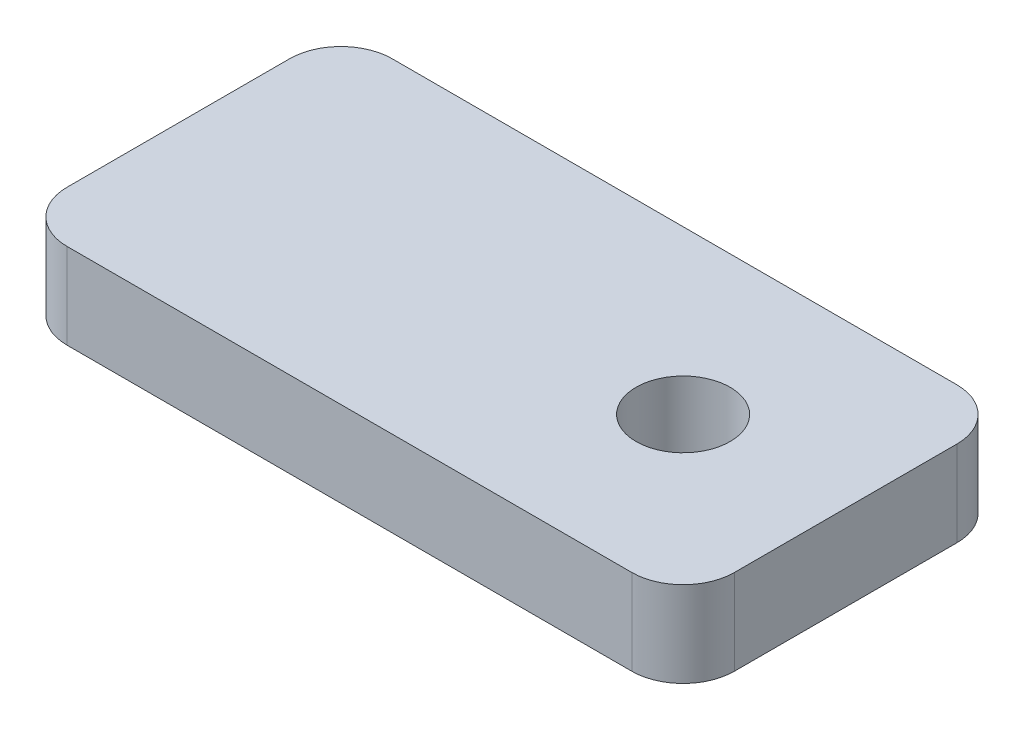
ISO-10303-21;
HEADER;
FILE_DESCRIPTION(('STEP AP214'),'2;1');
FILE_NAME('part.step','',(''),(''),'','','');
FILE_SCHEMA(('AUTOMOTIVE_DESIGN { 1 0 10303 214 1 1 1 1 }'));
ENDSEC;
DATA;
#1=APPLICATION_CONTEXT('core data for automotive mechanical design processes');
#2=APPLICATION_PROTOCOL_DEFINITION('international standard','automotive_design',2000,#1);
#3=PRODUCT_CONTEXT('',#1,'mechanical');
#4=PRODUCT('Part','Part','',(#3));
#5=PRODUCT_RELATED_PRODUCT_CATEGORY('part','',(#4));
#6=PRODUCT_DEFINITION_FORMATION('','',#4);
#7=PRODUCT_DEFINITION_CONTEXT('part definition',#1,'design');
#8=PRODUCT_DEFINITION('design','',#6,#7);
#9=PRODUCT_DEFINITION_SHAPE('','',#8);
#10=(LENGTH_UNIT() NAMED_UNIT(*) SI_UNIT(.MILLI.,.METRE.));
#11=(NAMED_UNIT(*) PLANE_ANGLE_UNIT() SI_UNIT($,.RADIAN.));
#12=(NAMED_UNIT(*) SI_UNIT($,.STERADIAN.) SOLID_ANGLE_UNIT());
#13=UNCERTAINTY_MEASURE_WITH_UNIT(LENGTH_MEASURE(1.E-05),#10,'distance_accuracy_value','');
#14=(GEOMETRIC_REPRESENTATION_CONTEXT(3) GLOBAL_UNCERTAINTY_ASSIGNED_CONTEXT((#13)) GLOBAL_UNIT_ASSIGNED_CONTEXT((#10,
#11,#12)) REPRESENTATION_CONTEXT('',''));
#15=CARTESIAN_POINT('',(0.,0.,0.));
#16=DIRECTION('',(0.,0.,1.));
#17=DIRECTION('',(1.,0.,0.));
#18=AXIS2_PLACEMENT_3D('',#15,#16,#17);
#19=CARTESIAN_POINT('',(-16.5,-5.,6.5));
#20=DIRECTION('',(0.,1.,0.));
#21=DIRECTION('',(0.,0.,1.));
#22=AXIS2_PLACEMENT_3D('',#19,#20,#21);
#23=CYLINDRICAL_SURFACE('',#22,3.);
#24=CARTESIAN_POINT('',(-16.5,0.,6.5));
#25=DIRECTION('',(0.,1.,0.));
#26=DIRECTION('',(0.,0.,-1.));
#27=AXIS2_PLACEMENT_3D('',#24,#25,#26);
#28=CIRCLE('',#27,3.);
#29=CARTESIAN_POINT('',(-19.5,0.,6.5));
#30=VERTEX_POINT('',#29);
#31=CARTESIAN_POINT('',(-16.5,0.,9.49999999999999));
#32=VERTEX_POINT('',#31);
#33=EDGE_CURVE('E158',#30,#32,#28,.T.);
#34=ORIENTED_EDGE('',*,*,#33,.F.);
#35=DIRECTION('',(0.,1.,0.));
#36=VECTOR('',#35,1.);
#37=CARTESIAN_POINT('',(-19.5,-5.,6.5));
#38=LINE('',#37,#36);
#39=CARTESIAN_POINT('',(-19.5,-5.,6.5));
#40=VERTEX_POINT('',#39);
#41=EDGE_CURVE('E11',#40,#30,#38,.T.);
#42=ORIENTED_EDGE('',*,*,#41,.F.);
#43=CARTESIAN_POINT('',(-16.5,-5.,6.5));
#44=DIRECTION('',(0.,1.,0.));
#45=DIRECTION('',(0.,0.,-1.));
#46=AXIS2_PLACEMENT_3D('',#43,#44,#45);
#47=CIRCLE('',#46,3.);
#48=CARTESIAN_POINT('',(-16.5,-5.,9.49999999999999));
#49=VERTEX_POINT('',#48);
#50=EDGE_CURVE('E186',#40,#49,#47,.T.);
#51=ORIENTED_EDGE('',*,*,#50,.T.);
#52=DIRECTION('',(0.,1.,0.));
#53=VECTOR('',#52,1.);
#54=CARTESIAN_POINT('',(-16.5,-5.,9.49999999999999));
#55=LINE('',#54,#53);
#56=EDGE_CURVE('E45',#49,#32,#55,.T.);
#57=ORIENTED_EDGE('',*,*,#56,.T.);
#58=EDGE_LOOP('',(#34,#42,#51,#57));
#59=FACE_BOUND('',#58,.T.);
#60=ADVANCED_FACE('F42',(#59),#23,.T.);
#61=CARTESIAN_POINT('',(-19.5,-5.,6.5));
#62=DIRECTION('',(-1.,0.,0.));
#63=DIRECTION('',(0.,0.,1.));
#64=AXIS2_PLACEMENT_3D('',#61,#62,#63);
#65=PLANE('',#64);
#66=DIRECTION('',(0.,0.,1.));
#67=VECTOR('',#66,1.);
#68=CARTESIAN_POINT('',(-19.5,0.,6.5));
#69=LINE('',#68,#67);
#70=CARTESIAN_POINT('',(-19.5,0.,-6.49999999999999));
#71=VERTEX_POINT('',#70);
#72=EDGE_CURVE('E183',#71,#30,#69,.T.);
#73=ORIENTED_EDGE('',*,*,#72,.F.);
#74=DIRECTION('',(0.,1.,0.));
#75=VECTOR('',#74,1.);
#76=CARTESIAN_POINT('',(-19.5,-5.,-6.49999999999999));
#77=LINE('',#76,#75);
#78=CARTESIAN_POINT('',(-19.5,-5.,-6.49999999999999));
#79=VERTEX_POINT('',#78);
#80=EDGE_CURVE('E52',#79,#71,#77,.T.);
#81=ORIENTED_EDGE('',*,*,#80,.F.);
#82=DIRECTION('',(0.,0.,1.));
#83=VECTOR('',#82,1.);
#84=CARTESIAN_POINT('',(-19.5,-5.,6.5));
#85=LINE('',#84,#83);
#86=EDGE_CURVE('E143',#79,#40,#85,.T.);
#87=ORIENTED_EDGE('',*,*,#86,.T.);
#88=ORIENTED_EDGE('',*,*,#41,.T.);
#89=EDGE_LOOP('',(#73,#81,#87,#88));
#90=FACE_BOUND('',#89,.T.);
#91=ADVANCED_FACE('F202',(#90),#65,.T.);
#92=CARTESIAN_POINT('',(-16.5,-5.,-6.49999999999999));
#93=DIRECTION('',(0.,1.,0.));
#94=DIRECTION('',(0.,0.,1.));
#95=AXIS2_PLACEMENT_3D('',#92,#93,#94);
#96=CYLINDRICAL_SURFACE('',#95,3.);
#97=CARTESIAN_POINT('',(-16.5,0.,-6.49999999999999));
#98=DIRECTION('',(0.,1.,0.));
#99=DIRECTION('',(0.,0.,1.));
#100=AXIS2_PLACEMENT_3D('',#97,#98,#99);
#101=CIRCLE('',#100,3.);
#102=CARTESIAN_POINT('',(-16.5,0.,-9.49999999999999));
#103=VERTEX_POINT('',#102);
#104=EDGE_CURVE('E129',#103,#71,#101,.T.);
#105=ORIENTED_EDGE('',*,*,#104,.F.);
#106=DIRECTION('',(0.,1.,0.));
#107=VECTOR('',#106,1.);
#108=CARTESIAN_POINT('',(-16.5,-5.,-9.49999999999999));
#109=LINE('',#108,#107);
#110=CARTESIAN_POINT('',(-16.5,-5.,-9.49999999999999));
#111=VERTEX_POINT('',#110);
#112=EDGE_CURVE('E124',#111,#103,#109,.T.);
#113=ORIENTED_EDGE('',*,*,#112,.F.);
#114=CARTESIAN_POINT('',(-16.5,-5.,-6.49999999999999));
#115=DIRECTION('',(0.,1.,0.));
#116=DIRECTION('',(0.,0.,1.));
#117=AXIS2_PLACEMENT_3D('',#114,#115,#116);
#118=CIRCLE('',#117,3.);
#119=EDGE_CURVE('E127',#111,#79,#118,.T.);
#120=ORIENTED_EDGE('',*,*,#119,.T.);
#121=ORIENTED_EDGE('',*,*,#80,.T.);
#122=EDGE_LOOP('',(#105,#113,#120,#121));
#123=FACE_BOUND('',#122,.T.);
#124=ADVANCED_FACE('F126',(#123),#96,.T.);
#125=CARTESIAN_POINT('',(-16.5,-5.,-9.49999999999999));
#126=DIRECTION('',(0.,0.,-1.));
#127=DIRECTION('',(-1.,0.,0.));
#128=AXIS2_PLACEMENT_3D('',#125,#126,#127);
#129=PLANE('',#128);
#130=DIRECTION('',(-1.,0.,0.));
#131=VECTOR('',#130,1.);
#132=CARTESIAN_POINT('',(-16.5,0.,-9.49999999999999));
#133=LINE('',#132,#131);
#134=CARTESIAN_POINT('',(16.5,0.,-9.49999999999999));
#135=VERTEX_POINT('',#134);
#136=EDGE_CURVE('E178',#135,#103,#133,.T.);
#137=ORIENTED_EDGE('',*,*,#136,.F.);
#138=DIRECTION('',(0.,1.,0.));
#139=VECTOR('',#138,1.);
#140=CARTESIAN_POINT('',(16.5,-5.,-9.49999999999999));
#141=LINE('',#140,#139);
#142=CARTESIAN_POINT('',(16.5,-5.,-9.49999999999999));
#143=VERTEX_POINT('',#142);
#144=EDGE_CURVE('E135',#143,#135,#141,.T.);
#145=ORIENTED_EDGE('',*,*,#144,.F.);
#146=DIRECTION('',(-1.,0.,0.));
#147=VECTOR('',#146,1.);
#148=CARTESIAN_POINT('',(-16.5,-5.,-9.49999999999999));
#149=LINE('',#148,#147);
#150=EDGE_CURVE('E141',#143,#111,#149,.T.);
#151=ORIENTED_EDGE('',*,*,#150,.T.);
#152=ORIENTED_EDGE('',*,*,#112,.T.);
#153=EDGE_LOOP('',(#137,#145,#151,#152));
#154=FACE_BOUND('',#153,.T.);
#155=ADVANCED_FACE('F146',(#154),#129,.T.);
#156=CARTESIAN_POINT('',(16.5,-5.,-6.49999999999999));
#157=DIRECTION('',(0.,1.,0.));
#158=DIRECTION('',(0.,0.,1.));
#159=AXIS2_PLACEMENT_3D('',#156,#157,#158);
#160=CYLINDRICAL_SURFACE('',#159,3.);
#161=CARTESIAN_POINT('',(16.5,0.,-6.49999999999999));
#162=DIRECTION('',(0.,1.,0.));
#163=DIRECTION('',(0.,0.,1.));
#164=AXIS2_PLACEMENT_3D('',#161,#162,#163);
#165=CIRCLE('',#164,3.);
#166=CARTESIAN_POINT('',(19.5,0.,-6.49999999999999));
#167=VERTEX_POINT('',#166);
#168=EDGE_CURVE('E174',#167,#135,#165,.T.);
#169=ORIENTED_EDGE('',*,*,#168,.F.);
#170=DIRECTION('',(0.,1.,0.));
#171=VECTOR('',#170,1.);
#172=CARTESIAN_POINT('',(19.5,-5.,-6.49999999999999));
#173=LINE('',#172,#171);
#174=CARTESIAN_POINT('',(19.5,-5.,-6.49999999999999));
#175=VERTEX_POINT('',#174);
#176=EDGE_CURVE('E192',#175,#167,#173,.T.);
#177=ORIENTED_EDGE('',*,*,#176,.F.);
#178=CARTESIAN_POINT('',(16.5,-5.,-6.49999999999999));
#179=DIRECTION('',(0.,1.,0.));
#180=DIRECTION('',(0.,0.,1.));
#181=AXIS2_PLACEMENT_3D('',#178,#179,#180);
#182=CIRCLE('',#181,3.);
#183=EDGE_CURVE('E148',#175,#143,#182,.T.);
#184=ORIENTED_EDGE('',*,*,#183,.T.);
#185=ORIENTED_EDGE('',*,*,#144,.T.);
#186=EDGE_LOOP('',(#169,#177,#184,#185));
#187=FACE_BOUND('',#186,.T.);
#188=ADVANCED_FACE('F215',(#187),#160,.T.);
#189=CARTESIAN_POINT('',(19.5,-5.,6.5));
#190=DIRECTION('',(1.,0.,0.));
#191=DIRECTION('',(0.,0.,-1.));
#192=AXIS2_PLACEMENT_3D('',#189,#190,#191);
#193=PLANE('',#192);
#194=DIRECTION('',(0.,0.,-1.));
#195=VECTOR('',#194,1.);
#196=CARTESIAN_POINT('',(19.5,0.,6.5));
#197=LINE('',#196,#195);
#198=CARTESIAN_POINT('',(19.5,0.,6.5));
#199=VERTEX_POINT('',#198);
#200=EDGE_CURVE('E170',#199,#167,#197,.T.);
#201=ORIENTED_EDGE('',*,*,#200,.F.);
#202=DIRECTION('',(0.,1.,0.));
#203=VECTOR('',#202,1.);
#204=CARTESIAN_POINT('',(19.5,-5.,6.5));
#205=LINE('',#204,#203);
#206=CARTESIAN_POINT('',(19.5,-5.,6.5));
#207=VERTEX_POINT('',#206);
#208=EDGE_CURVE('E195',#207,#199,#205,.T.);
#209=ORIENTED_EDGE('',*,*,#208,.F.);
#210=DIRECTION('',(0.,0.,-1.));
#211=VECTOR('',#210,1.);
#212=CARTESIAN_POINT('',(19.5,-5.,6.5));
#213=LINE('',#212,#211);
#214=EDGE_CURVE('E152',#207,#175,#213,.T.);
#215=ORIENTED_EDGE('',*,*,#214,.T.);
#216=ORIENTED_EDGE('',*,*,#176,.T.);
#217=EDGE_LOOP('',(#201,#209,#215,#216));
#218=FACE_BOUND('',#217,.T.);
#219=ADVANCED_FACE('F218',(#218),#193,.T.);
#220=CARTESIAN_POINT('',(16.5,-5.,6.5));
#221=DIRECTION('',(0.,1.,0.));
#222=DIRECTION('',(0.,0.,1.));
#223=AXIS2_PLACEMENT_3D('',#220,#221,#222);
#224=CYLINDRICAL_SURFACE('',#223,3.);
#225=CARTESIAN_POINT('',(16.5,0.,6.5));
#226=DIRECTION('',(0.,1.,0.));
#227=DIRECTION('',(0.,0.,1.));
#228=AXIS2_PLACEMENT_3D('',#225,#226,#227);
#229=CIRCLE('',#228,3.);
#230=CARTESIAN_POINT('',(16.5,0.,9.49999999999999));
#231=VERTEX_POINT('',#230);
#232=EDGE_CURVE('E167',#231,#199,#229,.T.);
#233=ORIENTED_EDGE('',*,*,#232,.F.);
#234=DIRECTION('',(0.,1.,0.));
#235=VECTOR('',#234,1.);
#236=CARTESIAN_POINT('',(16.5,-5.,9.49999999999999));
#237=LINE('',#236,#235);
#238=CARTESIAN_POINT('',(16.5,-5.,9.49999999999999));
#239=VERTEX_POINT('',#238);
#240=EDGE_CURVE('E196',#239,#231,#237,.T.);
#241=ORIENTED_EDGE('',*,*,#240,.F.);
#242=CARTESIAN_POINT('',(16.5,-5.,6.5));
#243=DIRECTION('',(0.,1.,0.));
#244=DIRECTION('',(0.,0.,1.));
#245=AXIS2_PLACEMENT_3D('',#242,#243,#244);
#246=CIRCLE('',#245,3.);
#247=EDGE_CURVE('E256',#239,#207,#246,.T.);
#248=ORIENTED_EDGE('',*,*,#247,.T.);
#249=ORIENTED_EDGE('',*,*,#208,.T.);
#250=EDGE_LOOP('',(#233,#241,#248,#249));
#251=FACE_BOUND('',#250,.T.);
#252=ADVANCED_FACE('F222',(#251),#224,.T.);
#253=CARTESIAN_POINT('',(-16.5,-5.,9.49999999999999));
#254=DIRECTION('',(0.,0.,1.));
#255=DIRECTION('',(1.,0.,0.));
#256=AXIS2_PLACEMENT_3D('',#253,#254,#255);
#257=PLANE('',#256);
#258=DIRECTION('',(1.,0.,0.));
#259=VECTOR('',#258,1.);
#260=CARTESIAN_POINT('',(-16.5,0.,9.49999999999999));
#261=LINE('',#260,#259);
#262=EDGE_CURVE('E162',#32,#231,#261,.T.);
#263=ORIENTED_EDGE('',*,*,#262,.F.);
#264=ORIENTED_EDGE('',*,*,#56,.F.);
#265=DIRECTION('',(1.,0.,0.));
#266=VECTOR('',#265,1.);
#267=CARTESIAN_POINT('',(-16.5,-5.,9.49999999999999));
#268=LINE('',#267,#266);
#269=EDGE_CURVE('E254',#49,#239,#268,.T.);
#270=ORIENTED_EDGE('',*,*,#269,.T.);
#271=ORIENTED_EDGE('',*,*,#240,.T.);
#272=EDGE_LOOP('',(#263,#264,#270,#271));
#273=FACE_BOUND('',#272,.T.);
#274=ADVANCED_FACE('F199',(#273),#257,.T.);
#275=CARTESIAN_POINT('',(-16.5,-5.,6.5));
#276=DIRECTION('',(0.,-1.,0.));
#277=DIRECTION('',(0.,0.,-1.));
#278=AXIS2_PLACEMENT_3D('',#275,#276,#277);
#279=PLANE('',#278);
#280=CARTESIAN_POINT('',(10.,-5.,0.));
#281=DIRECTION('',(0.,1.,0.));
#282=DIRECTION('',(0.,0.,1.));
#283=AXIS2_PLACEMENT_3D('',#280,#281,#282);
#284=CIRCLE('',#283,2.75);
#285=CARTESIAN_POINT('',(10.,-5.,2.74999999999999));
#286=VERTEX_POINT('',#285);
#287=EDGE_CURVE('E163',#286,#286,#284,.T.);
#288=ORIENTED_EDGE('',*,*,#287,.T.);
#289=EDGE_LOOP('',(#288));
#290=FACE_BOUND('',#289,.T.);
#291=ORIENTED_EDGE('',*,*,#50,.F.);
#292=ORIENTED_EDGE('',*,*,#86,.F.);
#293=ORIENTED_EDGE('',*,*,#119,.F.);
#294=ORIENTED_EDGE('',*,*,#150,.F.);
#295=ORIENTED_EDGE('',*,*,#183,.F.);
#296=ORIENTED_EDGE('',*,*,#214,.F.);
#297=ORIENTED_EDGE('',*,*,#247,.F.);
#298=ORIENTED_EDGE('',*,*,#269,.F.);
#299=EDGE_LOOP('',(#291,#292,#293,#294,#295,#296,#297,#298));
#300=FACE_BOUND('',#299,.T.);
#301=ADVANCED_FACE('F139',(#290,#300),#279,.T.);
#302=CARTESIAN_POINT('',(-16.5,0.,6.5));
#303=DIRECTION('',(0.,-1.,0.));
#304=DIRECTION('',(0.,0.,-1.));
#305=AXIS2_PLACEMENT_3D('',#302,#303,#304);
#306=PLANE('',#305);
#307=CARTESIAN_POINT('',(10.,0.,0.));
#308=DIRECTION('',(0.,1.,0.));
#309=DIRECTION('',(0.,0.,1.));
#310=AXIS2_PLACEMENT_3D('',#307,#308,#309);
#311=CIRCLE('',#310,2.75);
#312=CARTESIAN_POINT('',(10.,0.,2.74999999999999));
#313=VERTEX_POINT('',#312);
#314=EDGE_CURVE('E246',#313,#313,#311,.T.);
#315=ORIENTED_EDGE('',*,*,#314,.F.);
#316=EDGE_LOOP('',(#315));
#317=FACE_BOUND('',#316,.T.);
#318=ORIENTED_EDGE('',*,*,#33,.T.);
#319=ORIENTED_EDGE('',*,*,#262,.T.);
#320=ORIENTED_EDGE('',*,*,#232,.T.);
#321=ORIENTED_EDGE('',*,*,#200,.T.);
#322=ORIENTED_EDGE('',*,*,#168,.T.);
#323=ORIENTED_EDGE('',*,*,#136,.T.);
#324=ORIENTED_EDGE('',*,*,#104,.T.);
#325=ORIENTED_EDGE('',*,*,#72,.T.);
#326=EDGE_LOOP('',(#318,#319,#320,#321,#322,#323,#324,#325));
#327=FACE_BOUND('',#326,.T.);
#328=ADVANCED_FACE('F201',(#317,#327),#306,.F.);
#329=CARTESIAN_POINT('',(10.,0.,0.));
#330=DIRECTION('',(0.,1.,0.));
#331=DIRECTION('',(0.,0.,1.));
#332=AXIS2_PLACEMENT_3D('',#329,#330,#331);
#333=CYLINDRICAL_SURFACE('',#332,2.75);
#334=ORIENTED_EDGE('',*,*,#287,.F.);
#335=EDGE_LOOP('',(#334));
#336=FACE_BOUND('',#335,.T.);
#337=ORIENTED_EDGE('',*,*,#314,.T.);
#338=EDGE_LOOP('',(#337));
#339=FACE_BOUND('',#338,.T.);
#340=ADVANCED_FACE('F234',(#336,#339),#333,.F.);
#341=CLOSED_SHELL('',(#60,#91,#124,#155,#188,#219,#252,#274,#301,#328,#340));
#342=MANIFOLD_SOLID_BREP('B2',#341);
#343=ADVANCED_BREP_SHAPE_REPRESENTATION('',(#18,#342),#14);
#344=SHAPE_DEFINITION_REPRESENTATION(#9,#343);
ENDSEC;
END-ISO-10303-21;
